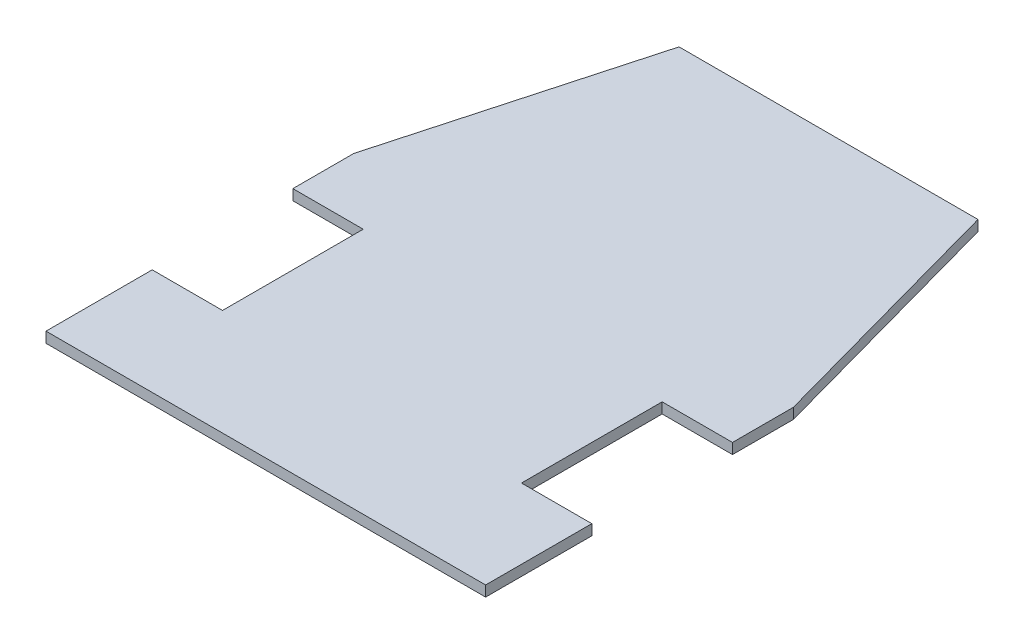
ISO-10303-21;
HEADER;
FILE_DESCRIPTION(('STEP AP214'),'2;1');
FILE_NAME('part.step','',(''),(''),'','','');
FILE_SCHEMA(('AUTOMOTIVE_DESIGN { 1 0 10303 214 1 1 1 1 }'));
ENDSEC;
DATA;
#1=APPLICATION_CONTEXT('core data for automotive mechanical design processes');
#2=APPLICATION_PROTOCOL_DEFINITION('international standard','automotive_design',2000,#1);
#3=PRODUCT_CONTEXT('',#1,'mechanical');
#4=PRODUCT('Part','Part','',(#3));
#5=PRODUCT_RELATED_PRODUCT_CATEGORY('part','',(#4));
#6=PRODUCT_DEFINITION_FORMATION('','',#4);
#7=PRODUCT_DEFINITION_CONTEXT('part definition',#1,'design');
#8=PRODUCT_DEFINITION('design','',#6,#7);
#9=PRODUCT_DEFINITION_SHAPE('','',#8);
#10=(LENGTH_UNIT() NAMED_UNIT(*) SI_UNIT(.MILLI.,.METRE.));
#11=(NAMED_UNIT(*) PLANE_ANGLE_UNIT() SI_UNIT($,.RADIAN.));
#12=(NAMED_UNIT(*) SI_UNIT($,.STERADIAN.) SOLID_ANGLE_UNIT());
#13=UNCERTAINTY_MEASURE_WITH_UNIT(LENGTH_MEASURE(1.E-05),#10,'distance_accuracy_value','');
#14=(GEOMETRIC_REPRESENTATION_CONTEXT(3) GLOBAL_UNCERTAINTY_ASSIGNED_CONTEXT((#13)) GLOBAL_UNIT_ASSIGNED_CONTEXT((#10,
#11,#12)) REPRESENTATION_CONTEXT('',''));
#15=CARTESIAN_POINT('',(0.,0.,0.));
#16=DIRECTION('',(0.,0.,1.));
#17=DIRECTION('',(1.,0.,0.));
#18=AXIS2_PLACEMENT_3D('',#15,#16,#17);
#19=CARTESIAN_POINT('',(0.,6.,0.));
#20=DIRECTION('',(0.,0.,-1.));
#21=DIRECTION('',(-1.,0.,0.));
#22=AXIS2_PLACEMENT_3D('',#19,#20,#21);
#23=PLANE('',#22);
#24=DIRECTION('',(1.,0.,0.));
#25=VECTOR('',#24,1.);
#26=CARTESIAN_POINT('',(0.,0.,0.));
#27=LINE('',#26,#25);
#28=CARTESIAN_POINT('',(0.,0.,0.));
#29=VERTEX_POINT('',#28);
#30=CARTESIAN_POINT('',(250.,0.,0.));
#31=VERTEX_POINT('',#30);
#32=EDGE_CURVE('E180',#29,#31,#27,.T.);
#33=ORIENTED_EDGE('',*,*,#32,.T.);
#34=DIRECTION('',(0.,-1.,0.));
#35=VECTOR('',#34,1.);
#36=CARTESIAN_POINT('',(250.,6.,0.));
#37=LINE('',#36,#35);
#38=CARTESIAN_POINT('',(250.,6.,0.));
#39=VERTEX_POINT('',#38);
#40=EDGE_CURVE('E11',#39,#31,#37,.T.);
#41=ORIENTED_EDGE('',*,*,#40,.F.);
#42=DIRECTION('',(1.,0.,0.));
#43=VECTOR('',#42,1.);
#44=CARTESIAN_POINT('',(0.,6.,0.));
#45=LINE('',#44,#43);
#46=CARTESIAN_POINT('',(0.,6.,0.));
#47=VERTEX_POINT('',#46);
#48=EDGE_CURVE('E220',#47,#39,#45,.T.);
#49=ORIENTED_EDGE('',*,*,#48,.F.);
#50=DIRECTION('',(0.,-1.,0.));
#51=VECTOR('',#50,1.);
#52=CARTESIAN_POINT('',(0.,6.,0.));
#53=LINE('',#52,#51);
#54=EDGE_CURVE('E176',#47,#29,#53,.T.);
#55=ORIENTED_EDGE('',*,*,#54,.T.);
#56=EDGE_LOOP('',(#33,#41,#49,#55));
#57=FACE_BOUND('',#56,.T.);
#58=ADVANCED_FACE('F43',(#57),#23,.F.);
#59=CARTESIAN_POINT('',(250.,6.,0.));
#60=DIRECTION('',(-1.,0.,0.));
#61=DIRECTION('',(0.,0.,1.));
#62=AXIS2_PLACEMENT_3D('',#59,#60,#61);
#63=PLANE('',#62);
#64=DIRECTION('',(0.,0.,-1.));
#65=VECTOR('',#64,1.);
#66=CARTESIAN_POINT('',(250.,0.,0.));
#67=LINE('',#66,#65);
#68=CARTESIAN_POINT('',(250.,0.,-60.3889204672967));
#69=VERTEX_POINT('',#68);
#70=EDGE_CURVE('E184',#31,#69,#67,.T.);
#71=ORIENTED_EDGE('',*,*,#70,.T.);
#72=DIRECTION('',(0.,-1.,0.));
#73=VECTOR('',#72,1.);
#74=CARTESIAN_POINT('',(250.,6.,-60.3889204672967));
#75=LINE('',#74,#73);
#76=CARTESIAN_POINT('',(250.,6.,-60.3889204672967));
#77=VERTEX_POINT('',#76);
#78=EDGE_CURVE('E52',#77,#69,#75,.T.);
#79=ORIENTED_EDGE('',*,*,#78,.F.);
#80=DIRECTION('',(0.,0.,-1.));
#81=VECTOR('',#80,1.);
#82=CARTESIAN_POINT('',(250.,6.,0.));
#83=LINE('',#82,#81);
#84=EDGE_CURVE('E121',#39,#77,#83,.T.);
#85=ORIENTED_EDGE('',*,*,#84,.F.);
#86=ORIENTED_EDGE('',*,*,#40,.T.);
#87=EDGE_LOOP('',(#71,#79,#85,#86));
#88=FACE_BOUND('',#87,.T.);
#89=ADVANCED_FACE('F328',(#88),#63,.F.);
#90=CARTESIAN_POINT('',(250.,6.,-60.3889204672967));
#91=DIRECTION('',(0.,0.,1.));
#92=DIRECTION('',(1.,0.,0.));
#93=AXIS2_PLACEMENT_3D('',#90,#91,#92);
#94=PLANE('',#93);
#95=DIRECTION('',(-1.,0.,0.));
#96=VECTOR('',#95,1.);
#97=CARTESIAN_POINT('',(250.,0.,-60.3889204672967));
#98=LINE('',#97,#96);
#99=CARTESIAN_POINT('',(210.,0.,-60.3889204672967));
#100=VERTEX_POINT('',#99);
#101=EDGE_CURVE('E187',#69,#100,#98,.T.);
#102=ORIENTED_EDGE('',*,*,#101,.T.);
#103=DIRECTION('',(0.,-1.,0.));
#104=VECTOR('',#103,1.);
#105=CARTESIAN_POINT('',(210.,6.,-60.3889204672967));
#106=LINE('',#105,#104);
#107=CARTESIAN_POINT('',(210.,6.,-60.3889204672967));
#108=VERTEX_POINT('',#107);
#109=EDGE_CURVE('E255',#108,#100,#106,.T.);
#110=ORIENTED_EDGE('',*,*,#109,.F.);
#111=DIRECTION('',(-1.,0.,0.));
#112=VECTOR('',#111,1.);
#113=CARTESIAN_POINT('',(250.,6.,-60.3889204672967));
#114=LINE('',#113,#112);
#115=EDGE_CURVE('E265',#77,#108,#114,.T.);
#116=ORIENTED_EDGE('',*,*,#115,.F.);
#117=ORIENTED_EDGE('',*,*,#78,.T.);
#118=EDGE_LOOP('',(#102,#110,#116,#117));
#119=FACE_BOUND('',#118,.T.);
#120=ADVANCED_FACE('F263',(#119),#94,.F.);
#121=CARTESIAN_POINT('',(210.,6.,-60.3889204672967));
#122=DIRECTION('',(-1.,0.,0.));
#123=DIRECTION('',(0.,0.,1.));
#124=AXIS2_PLACEMENT_3D('',#121,#122,#123);
#125=PLANE('',#124);
#126=DIRECTION('',(0.,0.,-1.));
#127=VECTOR('',#126,1.);
#128=CARTESIAN_POINT('',(210.,0.,-60.3889204672967));
#129=LINE('',#128,#127);
#130=CARTESIAN_POINT('',(210.,0.,-140.388920467297));
#131=VERTEX_POINT('',#130);
#132=EDGE_CURVE('E190',#100,#131,#129,.T.);
#133=ORIENTED_EDGE('',*,*,#132,.T.);
#134=DIRECTION('',(0.,-1.,0.));
#135=VECTOR('',#134,1.);
#136=CARTESIAN_POINT('',(210.,6.,-140.388920467297));
#137=LINE('',#136,#135);
#138=CARTESIAN_POINT('',(210.,6.,-140.388920467297));
#139=VERTEX_POINT('',#138);
#140=EDGE_CURVE('E251',#139,#131,#137,.T.);
#141=ORIENTED_EDGE('',*,*,#140,.F.);
#142=DIRECTION('',(0.,0.,-1.));
#143=VECTOR('',#142,1.);
#144=CARTESIAN_POINT('',(210.,6.,-60.3889204672967));
#145=LINE('',#144,#143);
#146=EDGE_CURVE('E284',#108,#139,#145,.T.);
#147=ORIENTED_EDGE('',*,*,#146,.F.);
#148=ORIENTED_EDGE('',*,*,#109,.T.);
#149=EDGE_LOOP('',(#133,#141,#147,#148));
#150=FACE_BOUND('',#149,.T.);
#151=ADVANCED_FACE('F274',(#150),#125,.F.);
#152=CARTESIAN_POINT('',(250.,6.,-140.388920467297));
#153=DIRECTION('',(0.,0.,-1.));
#154=DIRECTION('',(-1.,0.,0.));
#155=AXIS2_PLACEMENT_3D('',#152,#153,#154);
#156=PLANE('',#155);
#157=DIRECTION('',(1.,0.,0.));
#158=VECTOR('',#157,1.);
#159=CARTESIAN_POINT('',(250.,0.,-140.388920467297));
#160=LINE('',#159,#158);
#161=CARTESIAN_POINT('',(250.,0.,-140.388920467297));
#162=VERTEX_POINT('',#161);
#163=EDGE_CURVE('E193',#131,#162,#160,.T.);
#164=ORIENTED_EDGE('',*,*,#163,.T.);
#165=DIRECTION('',(0.,-1.,0.));
#166=VECTOR('',#165,1.);
#167=CARTESIAN_POINT('',(250.,6.,-140.388920467297));
#168=LINE('',#167,#166);
#169=CARTESIAN_POINT('',(250.,6.,-140.388920467297));
#170=VERTEX_POINT('',#169);
#171=EDGE_CURVE('E247',#170,#162,#168,.T.);
#172=ORIENTED_EDGE('',*,*,#171,.F.);
#173=DIRECTION('',(1.,0.,0.));
#174=VECTOR('',#173,1.);
#175=CARTESIAN_POINT('',(250.,6.,-140.388920467297));
#176=LINE('',#175,#174);
#177=EDGE_CURVE('E280',#139,#170,#176,.T.);
#178=ORIENTED_EDGE('',*,*,#177,.F.);
#179=ORIENTED_EDGE('',*,*,#140,.T.);
#180=EDGE_LOOP('',(#164,#172,#178,#179));
#181=FACE_BOUND('',#180,.T.);
#182=ADVANCED_FACE('F278',(#181),#156,.F.);
#183=CARTESIAN_POINT('',(250.,6.,-140.388920467297));
#184=DIRECTION('',(-1.,0.,0.));
#185=DIRECTION('',(0.,0.,1.));
#186=AXIS2_PLACEMENT_3D('',#183,#184,#185);
#187=PLANE('',#186);
#188=DIRECTION('',(0.,0.,-1.));
#189=VECTOR('',#188,1.);
#190=CARTESIAN_POINT('',(250.,0.,-140.388920467297));
#191=LINE('',#190,#189);
#192=CARTESIAN_POINT('',(250.,0.,-175.));
#193=VERTEX_POINT('',#192);
#194=EDGE_CURVE('E196',#162,#193,#191,.T.);
#195=ORIENTED_EDGE('',*,*,#194,.T.);
#196=DIRECTION('',(0.,-1.,0.));
#197=VECTOR('',#196,1.);
#198=CARTESIAN_POINT('',(250.,6.,-175.));
#199=LINE('',#198,#197);
#200=CARTESIAN_POINT('',(250.,6.,-175.));
#201=VERTEX_POINT('',#200);
#202=EDGE_CURVE('E243',#201,#193,#199,.T.);
#203=ORIENTED_EDGE('',*,*,#202,.F.);
#204=DIRECTION('',(0.,0.,-1.));
#205=VECTOR('',#204,1.);
#206=CARTESIAN_POINT('',(250.,6.,-140.388920467297));
#207=LINE('',#206,#205);
#208=EDGE_CURVE('E283',#170,#201,#207,.T.);
#209=ORIENTED_EDGE('',*,*,#208,.F.);
#210=ORIENTED_EDGE('',*,*,#171,.T.);
#211=EDGE_LOOP('',(#195,#203,#209,#210));
#212=FACE_BOUND('',#211,.T.);
#213=ADVANCED_FACE('F341',(#212),#187,.F.);
#214=CARTESIAN_POINT('',(250.,6.,-175.));
#215=DIRECTION('',(-0.963992618206074,0.,0.265928998125813));
#216=DIRECTION('',(0.265928998125813,0.,0.963992618206074));
#217=AXIS2_PLACEMENT_3D('',#214,#215,#216);
#218=PLANE('',#217);
#219=DIRECTION('',(-0.265928998125813,0.,-0.963992618206074));
#220=VECTOR('',#219,1.);
#221=CARTESIAN_POINT('',(250.,0.,-175.));
#222=LINE('',#221,#220);
#223=CARTESIAN_POINT('',(210.,0.,-320.));
#224=VERTEX_POINT('',#223);
#225=EDGE_CURVE('E199',#193,#224,#222,.T.);
#226=ORIENTED_EDGE('',*,*,#225,.T.);
#227=DIRECTION('',(0.,-1.,0.));
#228=VECTOR('',#227,1.);
#229=CARTESIAN_POINT('',(210.,6.,-320.));
#230=LINE('',#229,#228);
#231=CARTESIAN_POINT('',(210.,6.,-320.));
#232=VERTEX_POINT('',#231);
#233=EDGE_CURVE('E239',#232,#224,#230,.T.);
#234=ORIENTED_EDGE('',*,*,#233,.F.);
#235=DIRECTION('',(-0.265928998125813,0.,-0.963992618206074));
#236=VECTOR('',#235,1.);
#237=CARTESIAN_POINT('',(250.,6.,-175.));
#238=LINE('',#237,#236);
#239=EDGE_CURVE('E288',#201,#232,#238,.T.);
#240=ORIENTED_EDGE('',*,*,#239,.F.);
#241=ORIENTED_EDGE('',*,*,#202,.T.);
#242=EDGE_LOOP('',(#226,#234,#240,#241));
#243=FACE_BOUND('',#242,.T.);
#244=ADVANCED_FACE('F344',(#243),#218,.F.);
#245=CARTESIAN_POINT('',(40.,6.,-320.));
#246=DIRECTION('',(0.,0.,1.));
#247=DIRECTION('',(1.,0.,0.));
#248=AXIS2_PLACEMENT_3D('',#245,#246,#247);
#249=PLANE('',#248);
#250=DIRECTION('',(-1.,0.,0.));
#251=VECTOR('',#250,1.);
#252=CARTESIAN_POINT('',(40.,0.,-320.));
#253=LINE('',#252,#251);
#254=CARTESIAN_POINT('',(40.,0.,-320.));
#255=VERTEX_POINT('',#254);
#256=EDGE_CURVE('E202',#224,#255,#253,.T.);
#257=ORIENTED_EDGE('',*,*,#256,.T.);
#258=DIRECTION('',(0.,-1.,0.));
#259=VECTOR('',#258,1.);
#260=CARTESIAN_POINT('',(40.,6.,-320.));
#261=LINE('',#260,#259);
#262=CARTESIAN_POINT('',(40.,6.,-320.));
#263=VERTEX_POINT('',#262);
#264=EDGE_CURVE('E235',#263,#255,#261,.T.);
#265=ORIENTED_EDGE('',*,*,#264,.F.);
#266=DIRECTION('',(-1.,0.,0.));
#267=VECTOR('',#266,1.);
#268=CARTESIAN_POINT('',(40.,6.,-320.));
#269=LINE('',#268,#267);
#270=EDGE_CURVE('E295',#232,#263,#269,.T.);
#271=ORIENTED_EDGE('',*,*,#270,.F.);
#272=ORIENTED_EDGE('',*,*,#233,.T.);
#273=EDGE_LOOP('',(#257,#265,#271,#272));
#274=FACE_BOUND('',#273,.T.);
#275=ADVANCED_FACE('F348',(#274),#249,.F.);
#276=CARTESIAN_POINT('',(0.,6.,-175.));
#277=DIRECTION('',(0.963992618206074,0.,0.265928998125813));
#278=DIRECTION('',(0.265928998125813,0.,-0.963992618206074));
#279=AXIS2_PLACEMENT_3D('',#276,#277,#278);
#280=PLANE('',#279);
#281=DIRECTION('',(-0.265928998125813,0.,0.963992618206074));
#282=VECTOR('',#281,1.);
#283=CARTESIAN_POINT('',(0.,0.,-175.));
#284=LINE('',#283,#282);
#285=CARTESIAN_POINT('',(0.,0.,-175.));
#286=VERTEX_POINT('',#285);
#287=EDGE_CURVE('E205',#255,#286,#284,.T.);
#288=ORIENTED_EDGE('',*,*,#287,.T.);
#289=DIRECTION('',(0.,-1.,0.));
#290=VECTOR('',#289,1.);
#291=CARTESIAN_POINT('',(0.,6.,-175.));
#292=LINE('',#291,#290);
#293=CARTESIAN_POINT('',(0.,6.,-175.));
#294=VERTEX_POINT('',#293);
#295=EDGE_CURVE('E231',#294,#286,#292,.T.);
#296=ORIENTED_EDGE('',*,*,#295,.F.);
#297=DIRECTION('',(-0.265928998125813,0.,0.963992618206074));
#298=VECTOR('',#297,1.);
#299=CARTESIAN_POINT('',(0.,6.,-175.));
#300=LINE('',#299,#298);
#301=EDGE_CURVE('E298',#263,#294,#300,.T.);
#302=ORIENTED_EDGE('',*,*,#301,.F.);
#303=ORIENTED_EDGE('',*,*,#264,.T.);
#304=EDGE_LOOP('',(#288,#296,#302,#303));
#305=FACE_BOUND('',#304,.T.);
#306=ADVANCED_FACE('F352',(#305),#280,.F.);
#307=CARTESIAN_POINT('',(0.,6.,-140.388920467297));
#308=DIRECTION('',(1.,0.,0.));
#309=DIRECTION('',(0.,0.,-1.));
#310=AXIS2_PLACEMENT_3D('',#307,#308,#309);
#311=PLANE('',#310);
#312=DIRECTION('',(0.,0.,1.));
#313=VECTOR('',#312,1.);
#314=CARTESIAN_POINT('',(0.,0.,-140.388920467297));
#315=LINE('',#314,#313);
#316=CARTESIAN_POINT('',(0.,0.,-140.388920467297));
#317=VERTEX_POINT('',#316);
#318=EDGE_CURVE('E208',#286,#317,#315,.T.);
#319=ORIENTED_EDGE('',*,*,#318,.T.);
#320=DIRECTION('',(0.,-1.,0.));
#321=VECTOR('',#320,1.);
#322=CARTESIAN_POINT('',(0.,6.,-140.388920467297));
#323=LINE('',#322,#321);
#324=CARTESIAN_POINT('',(0.,6.,-140.388920467297));
#325=VERTEX_POINT('',#324);
#326=EDGE_CURVE('E227',#325,#317,#323,.T.);
#327=ORIENTED_EDGE('',*,*,#326,.F.);
#328=DIRECTION('',(0.,0.,1.));
#329=VECTOR('',#328,1.);
#330=CARTESIAN_POINT('',(0.,6.,-140.388920467297));
#331=LINE('',#330,#329);
#332=EDGE_CURVE('E301',#294,#325,#331,.T.);
#333=ORIENTED_EDGE('',*,*,#332,.F.);
#334=ORIENTED_EDGE('',*,*,#295,.T.);
#335=EDGE_LOOP('',(#319,#327,#333,#334));
#336=FACE_BOUND('',#335,.T.);
#337=ADVANCED_FACE('F309',(#336),#311,.F.);
#338=CARTESIAN_POINT('',(40.,6.,-140.388920467297));
#339=DIRECTION('',(0.,0.,-1.));
#340=DIRECTION('',(-1.,0.,0.));
#341=AXIS2_PLACEMENT_3D('',#338,#339,#340);
#342=PLANE('',#341);
#343=DIRECTION('',(1.,0.,0.));
#344=VECTOR('',#343,1.);
#345=CARTESIAN_POINT('',(40.,0.,-140.388920467297));
#346=LINE('',#345,#344);
#347=CARTESIAN_POINT('',(40.,0.,-140.388920467297));
#348=VERTEX_POINT('',#347);
#349=EDGE_CURVE('E211',#317,#348,#346,.T.);
#350=ORIENTED_EDGE('',*,*,#349,.T.);
#351=DIRECTION('',(0.,-1.,0.));
#352=VECTOR('',#351,1.);
#353=CARTESIAN_POINT('',(40.,6.,-140.388920467297));
#354=LINE('',#353,#352);
#355=CARTESIAN_POINT('',(40.,6.,-140.388920467297));
#356=VERTEX_POINT('',#355);
#357=EDGE_CURVE('E169',#356,#348,#354,.T.);
#358=ORIENTED_EDGE('',*,*,#357,.F.);
#359=DIRECTION('',(1.,0.,0.));
#360=VECTOR('',#359,1.);
#361=CARTESIAN_POINT('',(40.,6.,-140.388920467297));
#362=LINE('',#361,#360);
#363=EDGE_CURVE('E158',#325,#356,#362,.T.);
#364=ORIENTED_EDGE('',*,*,#363,.F.);
#365=ORIENTED_EDGE('',*,*,#326,.T.);
#366=EDGE_LOOP('',(#350,#358,#364,#365));
#367=FACE_BOUND('',#366,.T.);
#368=ADVANCED_FACE('F313',(#367),#342,.F.);
#369=CARTESIAN_POINT('',(40.,6.,-60.3889204672967));
#370=DIRECTION('',(1.,0.,0.));
#371=DIRECTION('',(0.,0.,-1.));
#372=AXIS2_PLACEMENT_3D('',#369,#370,#371);
#373=PLANE('',#372);
#374=DIRECTION('',(0.,0.,1.));
#375=VECTOR('',#374,1.);
#376=CARTESIAN_POINT('',(40.,0.,-60.3889204672967));
#377=LINE('',#376,#375);
#378=CARTESIAN_POINT('',(40.,0.,-60.3889204672967));
#379=VERTEX_POINT('',#378);
#380=EDGE_CURVE('E167',#348,#379,#377,.T.);
#381=ORIENTED_EDGE('',*,*,#380,.T.);
#382=DIRECTION('',(0.,-1.,0.));
#383=VECTOR('',#382,1.);
#384=CARTESIAN_POINT('',(40.,6.,-60.3889204672967));
#385=LINE('',#384,#383);
#386=CARTESIAN_POINT('',(40.,6.,-60.3889204672967));
#387=VERTEX_POINT('',#386);
#388=EDGE_CURVE('E164',#387,#379,#385,.T.);
#389=ORIENTED_EDGE('',*,*,#388,.F.);
#390=DIRECTION('',(0.,0.,1.));
#391=VECTOR('',#390,1.);
#392=CARTESIAN_POINT('',(40.,6.,-60.3889204672967));
#393=LINE('',#392,#391);
#394=EDGE_CURVE('E152',#356,#387,#393,.T.);
#395=ORIENTED_EDGE('',*,*,#394,.F.);
#396=ORIENTED_EDGE('',*,*,#357,.T.);
#397=EDGE_LOOP('',(#381,#389,#395,#396));
#398=FACE_BOUND('',#397,.T.);
#399=ADVANCED_FACE('F165',(#398),#373,.F.);
#400=CARTESIAN_POINT('',(0.,6.,-60.3889204672967));
#401=DIRECTION('',(0.,0.,1.));
#402=DIRECTION('',(1.,0.,0.));
#403=AXIS2_PLACEMENT_3D('',#400,#401,#402);
#404=PLANE('',#403);
#405=DIRECTION('',(-1.,0.,0.));
#406=VECTOR('',#405,1.);
#407=CARTESIAN_POINT('',(0.,0.,-60.3889204672967));
#408=LINE('',#407,#406);
#409=CARTESIAN_POINT('',(0.,0.,-60.3889204672967));
#410=VERTEX_POINT('',#409);
#411=EDGE_CURVE('E107',#379,#410,#408,.T.);
#412=ORIENTED_EDGE('',*,*,#411,.T.);
#413=DIRECTION('',(0.,-1.,0.));
#414=VECTOR('',#413,1.);
#415=CARTESIAN_POINT('',(0.,6.,-60.3889204672967));
#416=LINE('',#415,#414);
#417=CARTESIAN_POINT('',(0.,6.,-60.3889204672967));
#418=VERTEX_POINT('',#417);
#419=EDGE_CURVE('E170',#418,#410,#416,.T.);
#420=ORIENTED_EDGE('',*,*,#419,.F.);
#421=DIRECTION('',(-1.,0.,0.));
#422=VECTOR('',#421,1.);
#423=CARTESIAN_POINT('',(0.,6.,-60.3889204672967));
#424=LINE('',#423,#422);
#425=EDGE_CURVE('E156',#387,#418,#424,.T.);
#426=ORIENTED_EDGE('',*,*,#425,.F.);
#427=ORIENTED_EDGE('',*,*,#388,.T.);
#428=EDGE_LOOP('',(#412,#420,#426,#427));
#429=FACE_BOUND('',#428,.T.);
#430=ADVANCED_FACE('F172',(#429),#404,.F.);
#431=CARTESIAN_POINT('',(0.,6.,0.));
#432=DIRECTION('',(1.,0.,0.));
#433=DIRECTION('',(0.,0.,-1.));
#434=AXIS2_PLACEMENT_3D('',#431,#432,#433);
#435=PLANE('',#434);
#436=DIRECTION('',(0.,0.,1.));
#437=VECTOR('',#436,1.);
#438=CARTESIAN_POINT('',(0.,0.,0.));
#439=LINE('',#438,#437);
#440=EDGE_CURVE('E113',#410,#29,#439,.T.);
#441=ORIENTED_EDGE('',*,*,#440,.T.);
#442=ORIENTED_EDGE('',*,*,#54,.F.);
#443=DIRECTION('',(0.,0.,1.));
#444=VECTOR('',#443,1.);
#445=CARTESIAN_POINT('',(0.,6.,0.));
#446=LINE('',#445,#444);
#447=EDGE_CURVE('E60',#418,#47,#446,.T.);
#448=ORIENTED_EDGE('',*,*,#447,.F.);
#449=ORIENTED_EDGE('',*,*,#419,.T.);
#450=EDGE_LOOP('',(#441,#442,#448,#449));
#451=FACE_BOUND('',#450,.T.);
#452=ADVANCED_FACE('F317',(#451),#435,.F.);
#453=CARTESIAN_POINT('',(0.,6.,0.));
#454=DIRECTION('',(0.,1.,0.));
#455=DIRECTION('',(0.,0.,1.));
#456=AXIS2_PLACEMENT_3D('',#453,#454,#455);
#457=PLANE('',#456);
#458=ORIENTED_EDGE('',*,*,#48,.T.);
#459=ORIENTED_EDGE('',*,*,#84,.T.);
#460=ORIENTED_EDGE('',*,*,#115,.T.);
#461=ORIENTED_EDGE('',*,*,#146,.T.);
#462=ORIENTED_EDGE('',*,*,#177,.T.);
#463=ORIENTED_EDGE('',*,*,#208,.T.);
#464=ORIENTED_EDGE('',*,*,#239,.T.);
#465=ORIENTED_EDGE('',*,*,#270,.T.);
#466=ORIENTED_EDGE('',*,*,#301,.T.);
#467=ORIENTED_EDGE('',*,*,#332,.T.);
#468=ORIENTED_EDGE('',*,*,#363,.T.);
#469=ORIENTED_EDGE('',*,*,#394,.T.);
#470=ORIENTED_EDGE('',*,*,#425,.T.);
#471=ORIENTED_EDGE('',*,*,#447,.T.);
#472=EDGE_LOOP('',(#458,#459,#460,#461,#462,#463,#464,#465,#466,#467,#468,#469,#470,#471));
#473=FACE_BOUND('',#472,.T.);
#474=ADVANCED_FACE('F154',(#473),#457,.T.);
#475=CARTESIAN_POINT('',(0.,0.,0.));
#476=DIRECTION('',(0.,1.,0.));
#477=DIRECTION('',(0.,0.,1.));
#478=AXIS2_PLACEMENT_3D('',#475,#476,#477);
#479=PLANE('',#478);
#480=ORIENTED_EDGE('',*,*,#32,.F.);
#481=ORIENTED_EDGE('',*,*,#440,.F.);
#482=ORIENTED_EDGE('',*,*,#411,.F.);
#483=ORIENTED_EDGE('',*,*,#380,.F.);
#484=ORIENTED_EDGE('',*,*,#349,.F.);
#485=ORIENTED_EDGE('',*,*,#318,.F.);
#486=ORIENTED_EDGE('',*,*,#287,.F.);
#487=ORIENTED_EDGE('',*,*,#256,.F.);
#488=ORIENTED_EDGE('',*,*,#225,.F.);
#489=ORIENTED_EDGE('',*,*,#194,.F.);
#490=ORIENTED_EDGE('',*,*,#163,.F.);
#491=ORIENTED_EDGE('',*,*,#132,.F.);
#492=ORIENTED_EDGE('',*,*,#101,.F.);
#493=ORIENTED_EDGE('',*,*,#70,.F.);
#494=EDGE_LOOP('',(#480,#481,#482,#483,#484,#485,#486,#487,#488,#489,#490,#491,#492,#493));
#495=FACE_BOUND('',#494,.T.);
#496=ADVANCED_FACE('F269',(#495),#479,.F.);
#497=CLOSED_SHELL('',(#58,#89,#120,#151,#182,#213,#244,#275,#306,#337,#368,#399,#430,#452,#474,#496));
#498=MANIFOLD_SOLID_BREP('B2',#497);
#499=ADVANCED_BREP_SHAPE_REPRESENTATION('',(#18,#498),#14);
#500=SHAPE_DEFINITION_REPRESENTATION(#9,#499);
ENDSEC;
END-ISO-10303-21;
